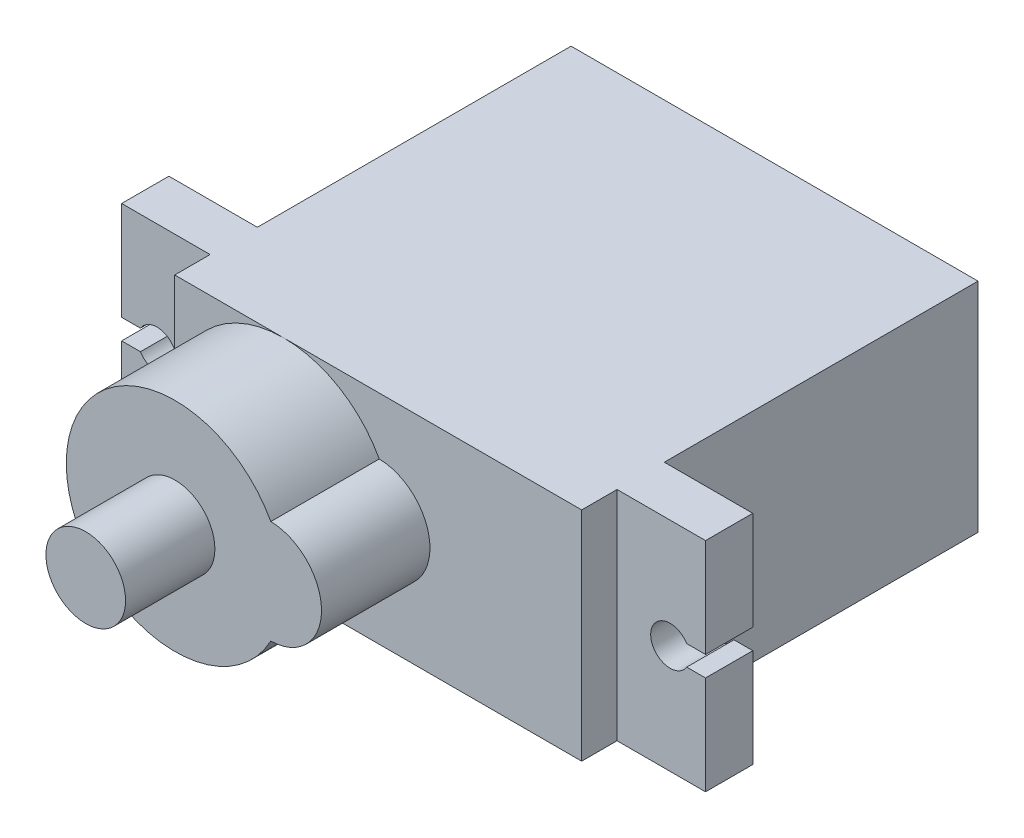
ISO-10303-21;
HEADER;
FILE_DESCRIPTION(('STEP AP214'),'2;1');
FILE_NAME('part.step','',(''),(''),'','','');
FILE_SCHEMA(('AUTOMOTIVE_DESIGN { 1 0 10303 214 1 1 1 1 }'));
ENDSEC;
DATA;
#1=APPLICATION_CONTEXT('core data for automotive mechanical design processes');
#2=APPLICATION_PROTOCOL_DEFINITION('international standard','automotive_design',2000,#1);
#3=PRODUCT_CONTEXT('',#1,'mechanical');
#4=PRODUCT('Part','Part','',(#3));
#5=PRODUCT_RELATED_PRODUCT_CATEGORY('part','',(#4));
#6=PRODUCT_DEFINITION_FORMATION('','',#4);
#7=PRODUCT_DEFINITION_CONTEXT('part definition',#1,'design');
#8=PRODUCT_DEFINITION('design','',#6,#7);
#9=PRODUCT_DEFINITION_SHAPE('','',#8);
#10=(LENGTH_UNIT() NAMED_UNIT(*) SI_UNIT(.MILLI.,.METRE.));
#11=(NAMED_UNIT(*) PLANE_ANGLE_UNIT() SI_UNIT($,.RADIAN.));
#12=(NAMED_UNIT(*) SI_UNIT($,.STERADIAN.) SOLID_ANGLE_UNIT());
#13=UNCERTAINTY_MEASURE_WITH_UNIT(LENGTH_MEASURE(1.E-05),#10,'distance_accuracy_value','');
#14=(GEOMETRIC_REPRESENTATION_CONTEXT(3) GLOBAL_UNCERTAINTY_ASSIGNED_CONTEXT((#13)) GLOBAL_UNIT_ASSIGNED_CONTEXT((#10,
#11,#12)) REPRESENTATION_CONTEXT('',''));
#15=CARTESIAN_POINT('',(0.,0.,0.));
#16=DIRECTION('',(0.,0.,1.));
#17=DIRECTION('',(1.,0.,0.));
#18=AXIS2_PLACEMENT_3D('',#15,#16,#17);
#19=CARTESIAN_POINT('',(0.,0.,22.4));
#20=DIRECTION('',(0.,0.,1.));
#21=DIRECTION('',(1.,0.,0.));
#22=AXIS2_PLACEMENT_3D('',#19,#20,#21);
#23=PLANE('',#22);
#24=CARTESIAN_POINT('',(0.,0.,22.4));
#25=DIRECTION('',(0.,0.,1.));
#26=DIRECTION('',(1.,0.,0.));
#27=AXIS2_PLACEMENT_3D('',#24,#25,#26);
#28=CIRCLE('',#27,2.925);
#29=CARTESIAN_POINT('',(0.0602219626168257,-2.92437998817161,22.4));
#30=VERTEX_POINT('',#29);
#31=CARTESIAN_POINT('',(0.0602219626168275,2.92437998817161,22.4));
#32=VERTEX_POINT('',#31);
#33=EDGE_CURVE('E216',#30,#32,#28,.T.);
#34=ORIENTED_EDGE('',*,*,#33,.F.);
#35=CARTESIAN_POINT('',(-5.35,0.,22.4));
#36=DIRECTION('',(0.,0.,1.));
#37=DIRECTION('',(1.,0.,0.));
#38=AXIS2_PLACEMENT_3D('',#35,#36,#37);
#39=CIRCLE('',#38,6.15);
#40=CARTESIAN_POINT('',(-5.35,-6.15,22.4));
#41=VERTEX_POINT('',#40);
#42=EDGE_CURVE('E64',#41,#30,#39,.T.);
#43=ORIENTED_EDGE('',*,*,#42,.F.);
#44=DIRECTION('',(1.,0.,0.));
#45=VECTOR('',#44,1.);
#46=CARTESIAN_POINT('',(-11.5,-6.15,22.4));
#47=LINE('',#46,#45);
#48=CARTESIAN_POINT('',(11.5,-6.15,22.4));
#49=VERTEX_POINT('',#48);
#50=EDGE_CURVE('E327',#41,#49,#47,.T.);
#51=ORIENTED_EDGE('',*,*,#50,.T.);
#52=DIRECTION('',(0.,1.,0.));
#53=VECTOR('',#52,1.);
#54=CARTESIAN_POINT('',(11.5,6.15,22.4));
#55=LINE('',#54,#53);
#56=CARTESIAN_POINT('',(11.5,6.15,22.4));
#57=VERTEX_POINT('',#56);
#58=EDGE_CURVE('E316',#49,#57,#55,.T.);
#59=ORIENTED_EDGE('',*,*,#58,.T.);
#60=DIRECTION('',(-1.,0.,0.));
#61=VECTOR('',#60,1.);
#62=CARTESIAN_POINT('',(-11.5,6.15,22.4));
#63=LINE('',#62,#61);
#64=CARTESIAN_POINT('',(-5.35,6.15,22.4));
#65=VERTEX_POINT('',#64);
#66=EDGE_CURVE('E321',#57,#65,#63,.T.);
#67=ORIENTED_EDGE('',*,*,#66,.T.);
#68=EDGE_CURVE('E52',#32,#65,#39,.T.);
#69=ORIENTED_EDGE('',*,*,#68,.F.);
#70=EDGE_LOOP('',(#34,#43,#51,#59,#67,#69));
#71=FACE_BOUND('',#70,.T.);
#72=ADVANCED_FACE('F41',(#71),#23,.T.);
#73=CARTESIAN_POINT('',(-11.5,0.,22.4));
#74=VERTEX_POINT('',#73);
#75=EDGE_CURVE('E11',#65,#74,#39,.T.);
#76=ORIENTED_EDGE('',*,*,#75,.F.);
#77=CARTESIAN_POINT('',(-11.5,6.15,22.4));
#78=VERTEX_POINT('',#77);
#79=EDGE_CURVE('E319',#65,#78,#63,.T.);
#80=ORIENTED_EDGE('',*,*,#79,.T.);
#81=DIRECTION('',(0.,-1.,0.));
#82=VECTOR('',#81,1.);
#83=CARTESIAN_POINT('',(-11.5,6.15,22.4));
#84=LINE('',#83,#82);
#85=EDGE_CURVE('E324',#78,#74,#84,.T.);
#86=ORIENTED_EDGE('',*,*,#85,.T.);
#87=EDGE_LOOP('',(#76,#80,#86));
#88=FACE_BOUND('',#87,.T.);
#89=ADVANCED_FACE('F395',(#88),#23,.T.);
#90=CARTESIAN_POINT('',(-16.5,6.15,20.4));
#91=DIRECTION('',(0.,0.,1.));
#92=DIRECTION('',(1.,0.,0.));
#93=AXIS2_PLACEMENT_3D('',#90,#91,#92);
#94=PLANE('',#93);
#95=CARTESIAN_POINT('',(-14.5,0.,20.4));
#96=DIRECTION('',(0.,0.,-1.));
#97=DIRECTION('',(-1.,0.,0.));
#98=AXIS2_PLACEMENT_3D('',#95,#96,#97);
#99=CIRCLE('',#98,1.1);
#100=CARTESIAN_POINT('',(-15.4377499666755,0.575,20.4));
#101=VERTEX_POINT('',#100);
#102=CARTESIAN_POINT('',(-15.4377499666755,-0.575,20.4));
#103=VERTEX_POINT('',#102);
#104=EDGE_CURVE('E217',#101,#103,#99,.T.);
#105=ORIENTED_EDGE('',*,*,#104,.T.);
#106=DIRECTION('',(-1.,0.,0.));
#107=VECTOR('',#106,1.);
#108=CARTESIAN_POINT('',(-15.4377499666755,-0.575,20.4));
#109=LINE('',#108,#107);
#110=CARTESIAN_POINT('',(-16.5,-0.575,20.4));
#111=VERTEX_POINT('',#110);
#112=EDGE_CURVE('E226',#103,#111,#109,.T.);
#113=ORIENTED_EDGE('',*,*,#112,.T.);
#114=DIRECTION('',(0.,-1.,0.));
#115=VECTOR('',#114,1.);
#116=CARTESIAN_POINT('',(-16.5,6.15,20.4));
#117=LINE('',#116,#115);
#118=CARTESIAN_POINT('',(-16.5,-6.15,20.4));
#119=VERTEX_POINT('',#118);
#120=EDGE_CURVE('E244',#111,#119,#117,.T.);
#121=ORIENTED_EDGE('',*,*,#120,.T.);
#122=DIRECTION('',(1.,0.,0.));
#123=VECTOR('',#122,1.);
#124=CARTESIAN_POINT('',(-16.5,-6.15,20.4));
#125=LINE('',#124,#123);
#126=CARTESIAN_POINT('',(-11.5,-6.15,20.4));
#127=VERTEX_POINT('',#126);
#128=EDGE_CURVE('E254',#119,#127,#125,.T.);
#129=ORIENTED_EDGE('',*,*,#128,.T.);
#130=DIRECTION('',(0.,-1.,0.));
#131=VECTOR('',#130,1.);
#132=CARTESIAN_POINT('',(-11.5,6.15,20.4));
#133=LINE('',#132,#131);
#134=CARTESIAN_POINT('',(-11.5,6.15,20.4));
#135=VERTEX_POINT('',#134);
#136=EDGE_CURVE('E239',#135,#127,#133,.T.);
#137=ORIENTED_EDGE('',*,*,#136,.F.);
#138=DIRECTION('',(1.,0.,0.));
#139=VECTOR('',#138,1.);
#140=CARTESIAN_POINT('',(-16.5,6.15,20.4));
#141=LINE('',#140,#139);
#142=CARTESIAN_POINT('',(-16.5,6.15,20.4));
#143=VERTEX_POINT('',#142);
#144=EDGE_CURVE('E265',#143,#135,#141,.T.);
#145=ORIENTED_EDGE('',*,*,#144,.F.);
#146=CARTESIAN_POINT('',(-16.5,0.575,20.4));
#147=VERTEX_POINT('',#146);
#148=EDGE_CURVE('E240',#143,#147,#117,.T.);
#149=ORIENTED_EDGE('',*,*,#148,.T.);
#150=DIRECTION('',(1.,0.,0.));
#151=VECTOR('',#150,1.);
#152=CARTESIAN_POINT('',(-15.4377499666755,0.575,20.4));
#153=LINE('',#152,#151);
#154=EDGE_CURVE('E220',#147,#101,#153,.T.);
#155=ORIENTED_EDGE('',*,*,#154,.T.);
#156=EDGE_LOOP('',(#105,#113,#121,#129,#137,#145,#149,#155));
#157=FACE_BOUND('',#156,.T.);
#158=ADVANCED_FACE('F402',(#157),#94,.T.);
#159=CARTESIAN_POINT('',(-16.5,6.15,17.73));
#160=DIRECTION('',(0.,0.,-1.));
#161=DIRECTION('',(-1.,0.,0.));
#162=AXIS2_PLACEMENT_3D('',#159,#160,#161);
#163=PLANE('',#162);
#164=DIRECTION('',(0.,1.,0.));
#165=VECTOR('',#164,1.);
#166=CARTESIAN_POINT('',(-16.5,6.15,17.73));
#167=LINE('',#166,#165);
#168=CARTESIAN_POINT('',(-16.5,-6.15,17.73));
#169=VERTEX_POINT('',#168);
#170=CARTESIAN_POINT('',(-16.5,-0.575,17.73));
#171=VERTEX_POINT('',#170);
#172=EDGE_CURVE('E248',#169,#171,#167,.T.);
#173=ORIENTED_EDGE('',*,*,#172,.T.);
#174=DIRECTION('',(1.,0.,0.));
#175=VECTOR('',#174,1.);
#176=CARTESIAN_POINT('',(-16.5,-0.575,17.73));
#177=LINE('',#176,#175);
#178=CARTESIAN_POINT('',(-15.4377499666755,-0.575,17.73));
#179=VERTEX_POINT('',#178);
#180=EDGE_CURVE('E236',#171,#179,#177,.T.);
#181=ORIENTED_EDGE('',*,*,#180,.T.);
#182=CARTESIAN_POINT('',(-14.5,0.,17.73));
#183=DIRECTION('',(0.,0.,-1.));
#184=DIRECTION('',(-1.,0.,0.));
#185=AXIS2_PLACEMENT_3D('',#182,#183,#184);
#186=CIRCLE('',#185,1.1);
#187=CARTESIAN_POINT('',(-15.4377499666755,0.575,17.73));
#188=VERTEX_POINT('',#187);
#189=EDGE_CURVE('E45',#179,#188,#186,.F.);
#190=ORIENTED_EDGE('',*,*,#189,.T.);
#191=DIRECTION('',(-1.,0.,0.));
#192=VECTOR('',#191,1.);
#193=CARTESIAN_POINT('',(-16.5,0.575,17.73));
#194=LINE('',#193,#192);
#195=CARTESIAN_POINT('',(-16.5,0.575,17.73));
#196=VERTEX_POINT('',#195);
#197=EDGE_CURVE('E232',#188,#196,#194,.T.);
#198=ORIENTED_EDGE('',*,*,#197,.T.);
#199=CARTESIAN_POINT('',(-16.5,6.15,17.73));
#200=VERTEX_POINT('',#199);
#201=EDGE_CURVE('E247',#196,#200,#167,.T.);
#202=ORIENTED_EDGE('',*,*,#201,.T.);
#203=DIRECTION('',(1.,0.,0.));
#204=VECTOR('',#203,1.);
#205=CARTESIAN_POINT('',(-16.5,6.15,17.73));
#206=LINE('',#205,#204);
#207=CARTESIAN_POINT('',(-11.5,6.15,17.73));
#208=VERTEX_POINT('',#207);
#209=EDGE_CURVE('E263',#200,#208,#206,.T.);
#210=ORIENTED_EDGE('',*,*,#209,.T.);
#211=DIRECTION('',(0.,1.,0.));
#212=VECTOR('',#211,1.);
#213=CARTESIAN_POINT('',(-11.5,6.15,17.73));
#214=LINE('',#213,#212);
#215=CARTESIAN_POINT('',(-11.5,-6.15,17.73));
#216=VERTEX_POINT('',#215);
#217=EDGE_CURVE('E257',#216,#208,#214,.T.);
#218=ORIENTED_EDGE('',*,*,#217,.F.);
#219=DIRECTION('',(1.,0.,0.));
#220=VECTOR('',#219,1.);
#221=CARTESIAN_POINT('',(-16.5,-6.15,17.73));
#222=LINE('',#221,#220);
#223=EDGE_CURVE('E261',#169,#216,#222,.T.);
#224=ORIENTED_EDGE('',*,*,#223,.F.);
#225=EDGE_LOOP('',(#173,#181,#190,#198,#202,#210,#218,#224));
#226=FACE_BOUND('',#225,.T.);
#227=ADVANCED_FACE('F468',(#226),#163,.T.);
#228=CARTESIAN_POINT('',(-16.5,0.,0.));
#229=DIRECTION('',(-1.,0.,0.));
#230=DIRECTION('',(0.,0.,-1.));
#231=AXIS2_PLACEMENT_3D('',#228,#229,#230);
#232=PLANE('',#231);
#233=ORIENTED_EDGE('',*,*,#120,.F.);
#234=DIRECTION('',(0.,0.,-1.));
#235=VECTOR('',#234,1.);
#236=CARTESIAN_POINT('',(-16.5,-0.575,0.));
#237=LINE('',#236,#235);
#238=EDGE_CURVE('E365',#111,#171,#237,.T.);
#239=ORIENTED_EDGE('',*,*,#238,.T.);
#240=ORIENTED_EDGE('',*,*,#172,.F.);
#241=DIRECTION('',(0.,0.,-1.));
#242=VECTOR('',#241,1.);
#243=CARTESIAN_POINT('',(-16.5,-6.15,20.4));
#244=LINE('',#243,#242);
#245=EDGE_CURVE('E251',#119,#169,#244,.T.);
#246=ORIENTED_EDGE('',*,*,#245,.F.);
#247=EDGE_LOOP('',(#233,#239,#240,#246));
#248=FACE_BOUND('',#247,.T.);
#249=ADVANCED_FACE('F483',(#248),#232,.T.);
#250=ORIENTED_EDGE('',*,*,#201,.F.);
#251=DIRECTION('',(0.,0.,1.));
#252=VECTOR('',#251,1.);
#253=CARTESIAN_POINT('',(-16.5,0.575,0.));
#254=LINE('',#253,#252);
#255=EDGE_CURVE('E363',#196,#147,#254,.T.);
#256=ORIENTED_EDGE('',*,*,#255,.T.);
#257=ORIENTED_EDGE('',*,*,#148,.F.);
#258=DIRECTION('',(0.,0.,1.));
#259=VECTOR('',#258,1.);
#260=CARTESIAN_POINT('',(-16.5,6.15,20.4));
#261=LINE('',#260,#259);
#262=EDGE_CURVE('E243',#200,#143,#261,.T.);
#263=ORIENTED_EDGE('',*,*,#262,.F.);
#264=EDGE_LOOP('',(#250,#256,#257,#263));
#265=FACE_BOUND('',#264,.T.);
#266=ADVANCED_FACE('F471',(#265),#232,.T.);
#267=CARTESIAN_POINT('',(-11.5,6.15,22.4));
#268=DIRECTION('',(1.,0.,0.));
#269=DIRECTION('',(0.,1.,0.));
#270=AXIS2_PLACEMENT_3D('',#267,#268,#269);
#271=PLANE('',#270);
#272=DIRECTION('',(0.,0.,-1.));
#273=VECTOR('',#272,1.);
#274=CARTESIAN_POINT('',(-11.5,6.15,22.4));
#275=LINE('',#274,#273);
#276=EDGE_CURVE('E349',#78,#135,#275,.T.);
#277=ORIENTED_EDGE('',*,*,#276,.T.);
#278=ORIENTED_EDGE('',*,*,#136,.T.);
#279=DIRECTION('',(0.,0.,-1.));
#280=VECTOR('',#279,1.);
#281=CARTESIAN_POINT('',(-11.5,-6.15,22.4));
#282=LINE('',#281,#280);
#283=CARTESIAN_POINT('',(-11.5,-6.15,22.4));
#284=VERTEX_POINT('',#283);
#285=EDGE_CURVE('E345',#284,#127,#282,.T.);
#286=ORIENTED_EDGE('',*,*,#285,.F.);
#287=EDGE_CURVE('E323',#74,#284,#84,.T.);
#288=ORIENTED_EDGE('',*,*,#287,.F.);
#289=ORIENTED_EDGE('',*,*,#85,.F.);
#290=EDGE_LOOP('',(#277,#278,#286,#288,#289));
#291=FACE_BOUND('',#290,.T.);
#292=ADVANCED_FACE('F425',(#291),#271,.F.);
#293=CARTESIAN_POINT('',(16.5,0.,0.));
#294=DIRECTION('',(1.,0.,0.));
#295=DIRECTION('',(0.,0.,-1.));
#296=AXIS2_PLACEMENT_3D('',#293,#294,#295);
#297=PLANE('',#296);
#298=DIRECTION('',(0.,0.,1.));
#299=VECTOR('',#298,1.);
#300=CARTESIAN_POINT('',(16.5,0.575,0.));
#301=LINE('',#300,#299);
#302=CARTESIAN_POINT('',(16.5,0.575,17.73));
#303=VERTEX_POINT('',#302);
#304=CARTESIAN_POINT('',(16.5,0.575,20.4));
#305=VERTEX_POINT('',#304);
#306=EDGE_CURVE('E358',#303,#305,#301,.T.);
#307=ORIENTED_EDGE('',*,*,#306,.F.);
#308=DIRECTION('',(0.,1.,0.));
#309=VECTOR('',#308,1.);
#310=CARTESIAN_POINT('',(16.5,6.15,17.73));
#311=LINE('',#310,#309);
#312=CARTESIAN_POINT('',(16.5,6.15,17.73));
#313=VERTEX_POINT('',#312);
#314=EDGE_CURVE('E292',#303,#313,#311,.T.);
#315=ORIENTED_EDGE('',*,*,#314,.T.);
#316=DIRECTION('',(0.,0.,1.));
#317=VECTOR('',#316,1.);
#318=CARTESIAN_POINT('',(16.5,6.15,20.4));
#319=LINE('',#318,#317);
#320=CARTESIAN_POINT('',(16.5,6.15,20.4));
#321=VERTEX_POINT('',#320);
#322=EDGE_CURVE('E296',#313,#321,#319,.T.);
#323=ORIENTED_EDGE('',*,*,#322,.T.);
#324=DIRECTION('',(0.,-1.,0.));
#325=VECTOR('',#324,1.);
#326=CARTESIAN_POINT('',(16.5,6.15,20.4));
#327=LINE('',#326,#325);
#328=EDGE_CURVE('E286',#321,#305,#327,.T.);
#329=ORIENTED_EDGE('',*,*,#328,.T.);
#330=EDGE_LOOP('',(#307,#315,#323,#329));
#331=FACE_BOUND('',#330,.T.);
#332=ADVANCED_FACE('F447',(#331),#297,.T.);
#333=CARTESIAN_POINT('',(11.5,6.15,22.4));
#334=DIRECTION('',(-1.,0.,0.));
#335=DIRECTION('',(0.,0.,1.));
#336=AXIS2_PLACEMENT_3D('',#333,#334,#335);
#337=PLANE('',#336);
#338=DIRECTION('',(0.,-1.,0.));
#339=VECTOR('',#338,1.);
#340=CARTESIAN_POINT('',(11.5,6.15,20.4));
#341=LINE('',#340,#339);
#342=CARTESIAN_POINT('',(11.5,6.15,20.4));
#343=VERTEX_POINT('',#342);
#344=CARTESIAN_POINT('',(11.5,-6.15,20.4));
#345=VERTEX_POINT('',#344);
#346=EDGE_CURVE('E285',#343,#345,#341,.T.);
#347=ORIENTED_EDGE('',*,*,#346,.F.);
#348=DIRECTION('',(0.,0.,-1.));
#349=VECTOR('',#348,1.);
#350=CARTESIAN_POINT('',(11.5,6.15,22.4));
#351=LINE('',#350,#349);
#352=EDGE_CURVE('E353',#57,#343,#351,.T.);
#353=ORIENTED_EDGE('',*,*,#352,.F.);
#354=ORIENTED_EDGE('',*,*,#58,.F.);
#355=DIRECTION('',(0.,0.,-1.));
#356=VECTOR('',#355,1.);
#357=CARTESIAN_POINT('',(11.5,-6.15,22.4));
#358=LINE('',#357,#356);
#359=EDGE_CURVE('E342',#49,#345,#358,.T.);
#360=ORIENTED_EDGE('',*,*,#359,.T.);
#361=EDGE_LOOP('',(#347,#353,#354,#360));
#362=FACE_BOUND('',#361,.T.);
#363=ADVANCED_FACE('F43',(#362),#337,.F.);
#364=DIRECTION('',(0.,1.,0.));
#365=VECTOR('',#364,1.);
#366=CARTESIAN_POINT('',(11.5,6.15,17.73));
#367=LINE('',#366,#365);
#368=CARTESIAN_POINT('',(11.5,-6.15,17.73));
#369=VERTEX_POINT('',#368);
#370=CARTESIAN_POINT('',(11.5,6.15,17.73));
#371=VERTEX_POINT('',#370);
#372=EDGE_CURVE('E301',#369,#371,#367,.T.);
#373=ORIENTED_EDGE('',*,*,#372,.F.);
#374=CARTESIAN_POINT('',(11.5,-6.15,0.));
#375=VERTEX_POINT('',#374);
#376=EDGE_CURVE('E331',#369,#375,#358,.T.);
#377=ORIENTED_EDGE('',*,*,#376,.T.);
#378=DIRECTION('',(0.,1.,0.));
#379=VECTOR('',#378,1.);
#380=CARTESIAN_POINT('',(11.5,6.15,0.));
#381=LINE('',#380,#379);
#382=CARTESIAN_POINT('',(11.5,6.15,0.));
#383=VERTEX_POINT('',#382);
#384=EDGE_CURVE('E315',#375,#383,#381,.T.);
#385=ORIENTED_EDGE('',*,*,#384,.T.);
#386=EDGE_CURVE('E352',#371,#383,#351,.T.);
#387=ORIENTED_EDGE('',*,*,#386,.F.);
#388=EDGE_LOOP('',(#373,#377,#385,#387));
#389=FACE_BOUND('',#388,.T.);
#390=ADVANCED_FACE('F457',(#389),#337,.F.);
#391=CARTESIAN_POINT('',(-11.5,6.15,22.4));
#392=DIRECTION('',(0.,-1.,0.));
#393=DIRECTION('',(0.,0.,-1.));
#394=AXIS2_PLACEMENT_3D('',#391,#392,#393);
#395=PLANE('',#394);
#396=DIRECTION('',(-1.,0.,0.));
#397=VECTOR('',#396,1.);
#398=CARTESIAN_POINT('',(-11.5,6.15,0.));
#399=LINE('',#398,#397);
#400=CARTESIAN_POINT('',(-11.5,6.15,0.));
#401=VERTEX_POINT('',#400);
#402=EDGE_CURVE('E334',#383,#401,#399,.T.);
#403=ORIENTED_EDGE('',*,*,#402,.T.);
#404=EDGE_CURVE('E348',#208,#401,#275,.T.);
#405=ORIENTED_EDGE('',*,*,#404,.F.);
#406=ORIENTED_EDGE('',*,*,#209,.F.);
#407=ORIENTED_EDGE('',*,*,#262,.T.);
#408=ORIENTED_EDGE('',*,*,#144,.T.);
#409=ORIENTED_EDGE('',*,*,#276,.F.);
#410=ORIENTED_EDGE('',*,*,#79,.F.);
#411=ORIENTED_EDGE('',*,*,#66,.F.);
#412=ORIENTED_EDGE('',*,*,#352,.T.);
#413=DIRECTION('',(-1.,0.,0.));
#414=VECTOR('',#413,1.);
#415=CARTESIAN_POINT('',(16.5,6.15,20.4));
#416=LINE('',#415,#414);
#417=EDGE_CURVE('E298',#321,#343,#416,.T.);
#418=ORIENTED_EDGE('',*,*,#417,.F.);
#419=ORIENTED_EDGE('',*,*,#322,.F.);
#420=DIRECTION('',(-1.,0.,0.));
#421=VECTOR('',#420,1.);
#422=CARTESIAN_POINT('',(16.5,6.15,17.73));
#423=LINE('',#422,#421);
#424=EDGE_CURVE('E306',#313,#371,#423,.T.);
#425=ORIENTED_EDGE('',*,*,#424,.T.);
#426=ORIENTED_EDGE('',*,*,#386,.T.);
#427=EDGE_LOOP('',(#403,#405,#406,#407,#408,#409,#410,#411,#412,#418,#419,#425,#426));
#428=FACE_BOUND('',#427,.T.);
#429=ADVANCED_FACE('F429',(#428),#395,.F.);
#430=CARTESIAN_POINT('',(-11.5,-6.15,0.));
#431=VERTEX_POINT('',#430);
#432=EDGE_CURVE('E344',#216,#431,#282,.T.);
#433=ORIENTED_EDGE('',*,*,#432,.F.);
#434=ORIENTED_EDGE('',*,*,#217,.T.);
#435=ORIENTED_EDGE('',*,*,#404,.T.);
#436=DIRECTION('',(0.,-1.,0.));
#437=VECTOR('',#436,1.);
#438=CARTESIAN_POINT('',(-11.5,6.15,0.));
#439=LINE('',#438,#437);
#440=EDGE_CURVE('E337',#401,#431,#439,.T.);
#441=ORIENTED_EDGE('',*,*,#440,.T.);
#442=EDGE_LOOP('',(#433,#434,#435,#441));
#443=FACE_BOUND('',#442,.T.);
#444=ADVANCED_FACE('F417',(#443),#271,.F.);
#445=CARTESIAN_POINT('',(-11.5,-6.15,22.4));
#446=DIRECTION('',(0.,1.,0.));
#447=DIRECTION('',(0.,0.,1.));
#448=AXIS2_PLACEMENT_3D('',#445,#446,#447);
#449=PLANE('',#448);
#450=DIRECTION('',(1.,0.,0.));
#451=VECTOR('',#450,1.);
#452=CARTESIAN_POINT('',(-11.5,-6.15,0.));
#453=LINE('',#452,#451);
#454=EDGE_CURVE('E320',#431,#375,#453,.T.);
#455=ORIENTED_EDGE('',*,*,#454,.T.);
#456=ORIENTED_EDGE('',*,*,#376,.F.);
#457=DIRECTION('',(-1.,0.,0.));
#458=VECTOR('',#457,1.);
#459=CARTESIAN_POINT('',(16.5,-6.15,17.73));
#460=LINE('',#459,#458);
#461=CARTESIAN_POINT('',(16.5,-6.15,17.73));
#462=VERTEX_POINT('',#461);
#463=EDGE_CURVE('E309',#462,#369,#460,.T.);
#464=ORIENTED_EDGE('',*,*,#463,.F.);
#465=DIRECTION('',(0.,0.,-1.));
#466=VECTOR('',#465,1.);
#467=CARTESIAN_POINT('',(16.5,-6.15,20.4));
#468=LINE('',#467,#466);
#469=CARTESIAN_POINT('',(16.5,-6.15,20.4));
#470=VERTEX_POINT('',#469);
#471=EDGE_CURVE('E289',#470,#462,#468,.T.);
#472=ORIENTED_EDGE('',*,*,#471,.F.);
#473=DIRECTION('',(-1.,0.,0.));
#474=VECTOR('',#473,1.);
#475=CARTESIAN_POINT('',(16.5,-6.15,20.4));
#476=LINE('',#475,#474);
#477=EDGE_CURVE('E312',#470,#345,#476,.T.);
#478=ORIENTED_EDGE('',*,*,#477,.T.);
#479=ORIENTED_EDGE('',*,*,#359,.F.);
#480=ORIENTED_EDGE('',*,*,#50,.F.);
#481=EDGE_CURVE('E328',#284,#41,#47,.T.);
#482=ORIENTED_EDGE('',*,*,#481,.F.);
#483=ORIENTED_EDGE('',*,*,#285,.T.);
#484=ORIENTED_EDGE('',*,*,#128,.F.);
#485=ORIENTED_EDGE('',*,*,#245,.T.);
#486=ORIENTED_EDGE('',*,*,#223,.T.);
#487=ORIENTED_EDGE('',*,*,#432,.T.);
#488=EDGE_LOOP('',(#455,#456,#464,#472,#478,#479,#480,#482,#483,#484,#485,#486,#487));
#489=FACE_BOUND('',#488,.T.);
#490=ADVANCED_FACE('F408',(#489),#449,.F.);
#491=EDGE_CURVE('E50',#74,#41,#39,.T.);
#492=ORIENTED_EDGE('',*,*,#491,.F.);
#493=ORIENTED_EDGE('',*,*,#287,.T.);
#494=ORIENTED_EDGE('',*,*,#481,.T.);
#495=EDGE_LOOP('',(#492,#493,#494));
#496=FACE_BOUND('',#495,.T.);
#497=ADVANCED_FACE('F397',(#496),#23,.T.);
#498=CARTESIAN_POINT('',(0.,0.,0.));
#499=DIRECTION('',(0.,0.,1.));
#500=DIRECTION('',(1.,0.,0.));
#501=AXIS2_PLACEMENT_3D('',#498,#499,#500);
#502=PLANE('',#501);
#503=ORIENTED_EDGE('',*,*,#384,.F.);
#504=ORIENTED_EDGE('',*,*,#454,.F.);
#505=ORIENTED_EDGE('',*,*,#440,.F.);
#506=ORIENTED_EDGE('',*,*,#402,.F.);
#507=EDGE_LOOP('',(#503,#504,#505,#506));
#508=FACE_BOUND('',#507,.T.);
#509=ADVANCED_FACE('F407',(#508),#502,.F.);
#510=CARTESIAN_POINT('',(16.5,6.15,20.4));
#511=DIRECTION('',(0.,0.,-1.));
#512=DIRECTION('',(-1.,0.,0.));
#513=AXIS2_PLACEMENT_3D('',#510,#511,#512);
#514=PLANE('',#513);
#515=CARTESIAN_POINT('',(14.5,0.,20.4));
#516=DIRECTION('',(0.,0.,1.));
#517=DIRECTION('',(1.,0.,0.));
#518=AXIS2_PLACEMENT_3D('',#515,#516,#517);
#519=CIRCLE('',#518,1.1);
#520=CARTESIAN_POINT('',(15.4377499666755,0.575,20.4));
#521=VERTEX_POINT('',#520);
#522=CARTESIAN_POINT('',(15.4377499666755,-0.575,20.4));
#523=VERTEX_POINT('',#522);
#524=EDGE_CURVE('E267',#521,#523,#519,.T.);
#525=ORIENTED_EDGE('',*,*,#524,.F.);
#526=DIRECTION('',(-1.,0.,0.));
#527=VECTOR('',#526,1.);
#528=CARTESIAN_POINT('',(15.4377499666755,0.575,20.4));
#529=LINE('',#528,#527);
#530=EDGE_CURVE('E272',#305,#521,#529,.T.);
#531=ORIENTED_EDGE('',*,*,#530,.F.);
#532=ORIENTED_EDGE('',*,*,#328,.F.);
#533=ORIENTED_EDGE('',*,*,#417,.T.);
#534=ORIENTED_EDGE('',*,*,#346,.T.);
#535=ORIENTED_EDGE('',*,*,#477,.F.);
#536=CARTESIAN_POINT('',(16.5,-0.575,20.4));
#537=VERTEX_POINT('',#536);
#538=EDGE_CURVE('E290',#537,#470,#327,.T.);
#539=ORIENTED_EDGE('',*,*,#538,.F.);
#540=DIRECTION('',(1.,0.,0.));
#541=VECTOR('',#540,1.);
#542=CARTESIAN_POINT('',(15.4377499666755,-0.575,20.4));
#543=LINE('',#542,#541);
#544=EDGE_CURVE('E270',#523,#537,#543,.T.);
#545=ORIENTED_EDGE('',*,*,#544,.F.);
#546=EDGE_LOOP('',(#525,#531,#532,#533,#534,#535,#539,#545));
#547=FACE_BOUND('',#546,.T.);
#548=ADVANCED_FACE('F415',(#547),#514,.F.);
#549=CARTESIAN_POINT('',(16.5,6.15,17.73));
#550=DIRECTION('',(0.,0.,1.));
#551=DIRECTION('',(1.,0.,0.));
#552=AXIS2_PLACEMENT_3D('',#549,#550,#551);
#553=PLANE('',#552);
#554=ORIENTED_EDGE('',*,*,#314,.F.);
#555=DIRECTION('',(-1.,0.,0.));
#556=VECTOR('',#555,1.);
#557=CARTESIAN_POINT('',(16.5,0.575,17.73));
#558=LINE('',#557,#556);
#559=CARTESIAN_POINT('',(15.4377499666755,0.575,17.73));
#560=VERTEX_POINT('',#559);
#561=EDGE_CURVE('E282',#303,#560,#558,.T.);
#562=ORIENTED_EDGE('',*,*,#561,.T.);
#563=CARTESIAN_POINT('',(14.5,0.,17.73));
#564=DIRECTION('',(0.,0.,1.));
#565=DIRECTION('',(1.,0.,0.));
#566=AXIS2_PLACEMENT_3D('',#563,#564,#565);
#567=CIRCLE('',#566,1.1);
#568=CARTESIAN_POINT('',(15.4377499666755,-0.575,17.73));
#569=VERTEX_POINT('',#568);
#570=EDGE_CURVE('E360',#560,#569,#567,.T.);
#571=ORIENTED_EDGE('',*,*,#570,.T.);
#572=DIRECTION('',(1.,0.,0.));
#573=VECTOR('',#572,1.);
#574=CARTESIAN_POINT('',(16.5,-0.575,17.73));
#575=LINE('',#574,#573);
#576=CARTESIAN_POINT('',(16.5,-0.575,17.73));
#577=VERTEX_POINT('',#576);
#578=EDGE_CURVE('E278',#569,#577,#575,.T.);
#579=ORIENTED_EDGE('',*,*,#578,.T.);
#580=EDGE_CURVE('E293',#462,#577,#311,.T.);
#581=ORIENTED_EDGE('',*,*,#580,.F.);
#582=ORIENTED_EDGE('',*,*,#463,.T.);
#583=ORIENTED_EDGE('',*,*,#372,.T.);
#584=ORIENTED_EDGE('',*,*,#424,.F.);
#585=EDGE_LOOP('',(#554,#562,#571,#579,#581,#582,#583,#584));
#586=FACE_BOUND('',#585,.T.);
#587=ADVANCED_FACE('F452',(#586),#553,.F.);
#588=DIRECTION('',(0.,0.,-1.));
#589=VECTOR('',#588,1.);
#590=CARTESIAN_POINT('',(16.5,-0.575,0.));
#591=LINE('',#590,#589);
#592=EDGE_CURVE('E356',#537,#577,#591,.T.);
#593=ORIENTED_EDGE('',*,*,#592,.F.);
#594=ORIENTED_EDGE('',*,*,#538,.T.);
#595=ORIENTED_EDGE('',*,*,#471,.T.);
#596=ORIENTED_EDGE('',*,*,#580,.T.);
#597=EDGE_LOOP('',(#593,#594,#595,#596));
#598=FACE_BOUND('',#597,.T.);
#599=ADVANCED_FACE('F507',(#598),#297,.T.);
#600=CARTESIAN_POINT('',(14.5,0.,0.));
#601=DIRECTION('',(0.,0.,1.));
#602=DIRECTION('',(1.,0.,0.));
#603=AXIS2_PLACEMENT_3D('',#600,#601,#602);
#604=CYLINDRICAL_SURFACE('',#603,1.1);
#605=DIRECTION('',(0.,0.,1.));
#606=VECTOR('',#605,1.);
#607=CARTESIAN_POINT('',(15.4377499666755,0.575,0.));
#608=LINE('',#607,#606);
#609=EDGE_CURVE('E276',#560,#521,#608,.T.);
#610=ORIENTED_EDGE('',*,*,#609,.T.);
#611=ORIENTED_EDGE('',*,*,#524,.T.);
#612=DIRECTION('',(0.,0.,1.));
#613=VECTOR('',#612,1.);
#614=CARTESIAN_POINT('',(15.4377499666755,-0.575,0.));
#615=LINE('',#614,#613);
#616=EDGE_CURVE('E275',#569,#523,#615,.T.);
#617=ORIENTED_EDGE('',*,*,#616,.F.);
#618=ORIENTED_EDGE('',*,*,#570,.F.);
#619=EDGE_LOOP('',(#610,#611,#617,#618));
#620=FACE_BOUND('',#619,.T.);
#621=ADVANCED_FACE('F500',(#620),#604,.F.);
#622=CARTESIAN_POINT('',(15.4377499666755,0.575,0.));
#623=DIRECTION('',(0.,1.,0.));
#624=DIRECTION('',(0.,0.,1.));
#625=AXIS2_PLACEMENT_3D('',#622,#623,#624);
#626=PLANE('',#625);
#627=ORIENTED_EDGE('',*,*,#306,.T.);
#628=ORIENTED_EDGE('',*,*,#530,.T.);
#629=ORIENTED_EDGE('',*,*,#609,.F.);
#630=ORIENTED_EDGE('',*,*,#561,.F.);
#631=EDGE_LOOP('',(#627,#628,#629,#630));
#632=FACE_BOUND('',#631,.T.);
#633=ADVANCED_FACE('F496',(#632),#626,.F.);
#634=CARTESIAN_POINT('',(15.4377499666755,-0.575,0.));
#635=DIRECTION('',(0.,-1.,0.));
#636=DIRECTION('',(0.,0.,-1.));
#637=AXIS2_PLACEMENT_3D('',#634,#635,#636);
#638=PLANE('',#637);
#639=ORIENTED_EDGE('',*,*,#616,.T.);
#640=ORIENTED_EDGE('',*,*,#544,.T.);
#641=ORIENTED_EDGE('',*,*,#592,.T.);
#642=ORIENTED_EDGE('',*,*,#578,.F.);
#643=EDGE_LOOP('',(#639,#640,#641,#642));
#644=FACE_BOUND('',#643,.T.);
#645=ADVANCED_FACE('F499',(#644),#638,.F.);
#646=CARTESIAN_POINT('',(-14.5,0.,0.));
#647=DIRECTION('',(0.,0.,1.));
#648=DIRECTION('',(1.,0.,0.));
#649=AXIS2_PLACEMENT_3D('',#646,#647,#648);
#650=CYLINDRICAL_SURFACE('',#649,1.1);
#651=DIRECTION('',(0.,0.,1.));
#652=VECTOR('',#651,1.);
#653=CARTESIAN_POINT('',(-15.4377499666755,-0.575,0.));
#654=LINE('',#653,#652);
#655=EDGE_CURVE('E230',#179,#103,#654,.T.);
#656=ORIENTED_EDGE('',*,*,#655,.T.);
#657=ORIENTED_EDGE('',*,*,#104,.F.);
#658=DIRECTION('',(0.,0.,1.));
#659=VECTOR('',#658,1.);
#660=CARTESIAN_POINT('',(-15.4377499666755,0.575,0.));
#661=LINE('',#660,#659);
#662=EDGE_CURVE('E229',#188,#101,#661,.T.);
#663=ORIENTED_EDGE('',*,*,#662,.F.);
#664=ORIENTED_EDGE('',*,*,#189,.F.);
#665=EDGE_LOOP('',(#656,#657,#663,#664));
#666=FACE_BOUND('',#665,.T.);
#667=ADVANCED_FACE('F478',(#666),#650,.F.);
#668=CARTESIAN_POINT('',(-15.4377499666755,-0.575,0.));
#669=DIRECTION('',(0.,1.,0.));
#670=DIRECTION('',(0.,0.,1.));
#671=AXIS2_PLACEMENT_3D('',#668,#669,#670);
#672=PLANE('',#671);
#673=ORIENTED_EDGE('',*,*,#238,.F.);
#674=ORIENTED_EDGE('',*,*,#112,.F.);
#675=ORIENTED_EDGE('',*,*,#655,.F.);
#676=ORIENTED_EDGE('',*,*,#180,.F.);
#677=EDGE_LOOP('',(#673,#674,#675,#676));
#678=FACE_BOUND('',#677,.T.);
#679=ADVANCED_FACE('F482',(#678),#672,.T.);
#680=CARTESIAN_POINT('',(-15.4377499666755,0.575,0.));
#681=DIRECTION('',(0.,-1.,0.));
#682=DIRECTION('',(0.,0.,-1.));
#683=AXIS2_PLACEMENT_3D('',#680,#681,#682);
#684=PLANE('',#683);
#685=ORIENTED_EDGE('',*,*,#662,.T.);
#686=ORIENTED_EDGE('',*,*,#154,.F.);
#687=ORIENTED_EDGE('',*,*,#255,.F.);
#688=ORIENTED_EDGE('',*,*,#197,.F.);
#689=EDGE_LOOP('',(#685,#686,#687,#688));
#690=FACE_BOUND('',#689,.T.);
#691=ADVANCED_FACE('F475',(#690),#684,.T.);
#692=CARTESIAN_POINT('',(0.,0.,28.53));
#693=DIRECTION('',(0.,0.,-1.));
#694=DIRECTION('',(-1.,0.,0.));
#695=AXIS2_PLACEMENT_3D('',#692,#693,#694);
#696=CYLINDRICAL_SURFACE('',#695,2.925);
#697=ORIENTED_EDGE('',*,*,#33,.T.);
#698=DIRECTION('',(0.,0.,-1.));
#699=VECTOR('',#698,1.);
#700=CARTESIAN_POINT('',(0.0602219626168275,2.92437998817161,28.53));
#701=LINE('',#700,#699);
#702=CARTESIAN_POINT('',(0.0602219626168275,2.92437998817161,28.53));
#703=VERTEX_POINT('',#702);
#704=EDGE_CURVE('E204',#703,#32,#701,.T.);
#705=ORIENTED_EDGE('',*,*,#704,.F.);
#706=CARTESIAN_POINT('',(0.,0.,28.53));
#707=DIRECTION('',(0.,0.,1.));
#708=DIRECTION('',(1.,0.,0.));
#709=AXIS2_PLACEMENT_3D('',#706,#707,#708);
#710=CIRCLE('',#709,2.925);
#711=CARTESIAN_POINT('',(0.0602219626168257,-2.92437998817161,28.53));
#712=VERTEX_POINT('',#711);
#713=EDGE_CURVE('E210',#712,#703,#710,.T.);
#714=ORIENTED_EDGE('',*,*,#713,.F.);
#715=DIRECTION('',(0.,0.,-1.));
#716=VECTOR('',#715,1.);
#717=CARTESIAN_POINT('',(0.0602219626168257,-2.92437998817161,28.53));
#718=LINE('',#717,#716);
#719=EDGE_CURVE('E207',#712,#30,#718,.T.);
#720=ORIENTED_EDGE('',*,*,#719,.T.);
#721=EDGE_LOOP('',(#697,#705,#714,#720));
#722=FACE_BOUND('',#721,.T.);
#723=ADVANCED_FACE('F215',(#722),#696,.T.);
#724=CARTESIAN_POINT('',(-5.35,0.,28.53));
#725=DIRECTION('',(0.,0.,-1.));
#726=DIRECTION('',(-1.,0.,0.));
#727=AXIS2_PLACEMENT_3D('',#724,#725,#726);
#728=CYLINDRICAL_SURFACE('',#727,6.15);
#729=ORIENTED_EDGE('',*,*,#68,.T.);
#730=ORIENTED_EDGE('',*,*,#75,.T.);
#731=ORIENTED_EDGE('',*,*,#491,.T.);
#732=ORIENTED_EDGE('',*,*,#42,.T.);
#733=ORIENTED_EDGE('',*,*,#719,.F.);
#734=CARTESIAN_POINT('',(-5.35,0.,28.53));
#735=DIRECTION('',(0.,0.,1.));
#736=DIRECTION('',(1.,0.,0.));
#737=AXIS2_PLACEMENT_3D('',#734,#735,#736);
#738=CIRCLE('',#737,6.15);
#739=EDGE_CURVE('E200',#703,#712,#738,.T.);
#740=ORIENTED_EDGE('',*,*,#739,.F.);
#741=ORIENTED_EDGE('',*,*,#704,.T.);
#742=EDGE_LOOP('',(#729,#730,#731,#732,#733,#740,#741));
#743=FACE_BOUND('',#742,.T.);
#744=ADVANCED_FACE('F202',(#743),#728,.T.);
#745=CARTESIAN_POINT('',(-2.675,0.,28.53));
#746=DIRECTION('',(0.,0.,1.));
#747=DIRECTION('',(1.,0.,0.));
#748=AXIS2_PLACEMENT_3D('',#745,#746,#747);
#749=PLANE('',#748);
#750=CARTESIAN_POINT('',(-5.35,0.,28.53));
#751=DIRECTION('',(0.,0.,1.));
#752=DIRECTION('',(1.,0.,0.));
#753=AXIS2_PLACEMENT_3D('',#750,#751,#752);
#754=CIRCLE('',#753,2.25);
#755=CARTESIAN_POINT('',(-3.1,0.,28.53));
#756=VERTEX_POINT('',#755);
#757=EDGE_CURVE('E376',#756,#756,#754,.T.);
#758=ORIENTED_EDGE('',*,*,#757,.F.);
#759=EDGE_LOOP('',(#758));
#760=FACE_BOUND('',#759,.T.);
#761=ORIENTED_EDGE('',*,*,#713,.T.);
#762=ORIENTED_EDGE('',*,*,#739,.T.);
#763=EDGE_LOOP('',(#761,#762));
#764=FACE_BOUND('',#763,.T.);
#765=ADVANCED_FACE('F212',(#760,#764),#749,.T.);
#766=CARTESIAN_POINT('',(-5.35,0.,33.58));
#767=DIRECTION('',(0.,0.,-1.));
#768=DIRECTION('',(-1.,0.,0.));
#769=AXIS2_PLACEMENT_3D('',#766,#767,#768);
#770=CYLINDRICAL_SURFACE('',#769,2.25);
#771=CARTESIAN_POINT('',(-5.35,0.,33.58));
#772=DIRECTION('',(0.,0.,1.));
#773=DIRECTION('',(1.,0.,0.));
#774=AXIS2_PLACEMENT_3D('',#771,#772,#773);
#775=CIRCLE('',#774,2.25);
#776=CARTESIAN_POINT('',(-3.1,0.,33.58));
#777=VERTEX_POINT('',#776);
#778=EDGE_CURVE('E374',#777,#777,#775,.T.);
#779=ORIENTED_EDGE('',*,*,#778,.F.);
#780=EDGE_LOOP('',(#779));
#781=FACE_BOUND('',#780,.T.);
#782=ORIENTED_EDGE('',*,*,#757,.T.);
#783=EDGE_LOOP('',(#782));
#784=FACE_BOUND('',#783,.T.);
#785=ADVANCED_FACE('F382',(#781,#784),#770,.T.);
#786=CARTESIAN_POINT('',(-5.35,0.,33.58));
#787=DIRECTION('',(0.,0.,1.));
#788=DIRECTION('',(1.,0.,0.));
#789=AXIS2_PLACEMENT_3D('',#786,#787,#788);
#790=PLANE('',#789);
#791=ORIENTED_EDGE('',*,*,#778,.T.);
#792=EDGE_LOOP('',(#791));
#793=FACE_BOUND('',#792,.T.);
#794=ADVANCED_FACE('F390',(#793),#790,.T.);
#795=CLOSED_SHELL('',(#72,#89,#158,#227,#249,#266,#292,#332,#363,#390,#429,#444,#490,#497,#509,
#548,#587,#599,#621,#633,#645,#667,#679,#691,#723,#744,#765,#785,#794));
#796=MANIFOLD_SOLID_BREP('B2',#795);
#797=ADVANCED_BREP_SHAPE_REPRESENTATION('',(#18,#796),#14);
#798=SHAPE_DEFINITION_REPRESENTATION(#9,#797);
ENDSEC;
END-ISO-10303-21;
